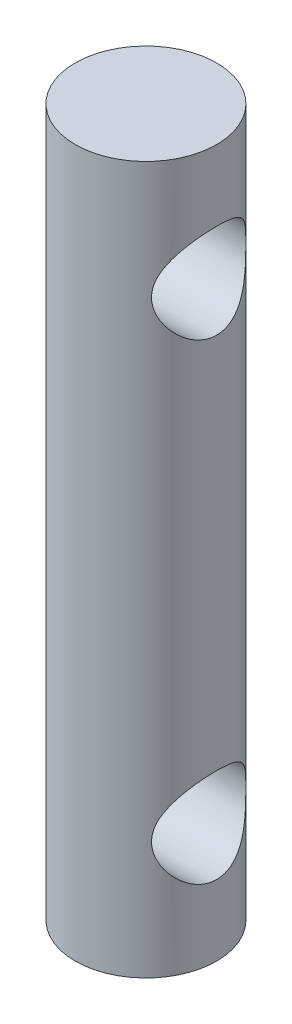
ISO-10303-21;
HEADER;
FILE_DESCRIPTION(('STEP AP214'),'2;1');
FILE_NAME('part.step','',(''),(''),'','','');
FILE_SCHEMA(('AUTOMOTIVE_DESIGN { 1 0 10303 214 1 1 1 1 }'));
ENDSEC;
DATA;
#1=APPLICATION_CONTEXT('core data for automotive mechanical design processes');
#2=APPLICATION_PROTOCOL_DEFINITION('international standard','automotive_design',2000,#1);
#3=PRODUCT_CONTEXT('',#1,'mechanical');
#4=PRODUCT('Part','Part','',(#3));
#5=PRODUCT_RELATED_PRODUCT_CATEGORY('part','',(#4));
#6=PRODUCT_DEFINITION_FORMATION('','',#4);
#7=PRODUCT_DEFINITION_CONTEXT('part definition',#1,'design');
#8=PRODUCT_DEFINITION('design','',#6,#7);
#9=PRODUCT_DEFINITION_SHAPE('','',#8);
#10=(LENGTH_UNIT() NAMED_UNIT(*) SI_UNIT(.MILLI.,.METRE.));
#11=(NAMED_UNIT(*) PLANE_ANGLE_UNIT() SI_UNIT($,.RADIAN.));
#12=(NAMED_UNIT(*) SI_UNIT($,.STERADIAN.) SOLID_ANGLE_UNIT());
#13=UNCERTAINTY_MEASURE_WITH_UNIT(LENGTH_MEASURE(1.E-05),#10,'distance_accuracy_value','');
#14=(GEOMETRIC_REPRESENTATION_CONTEXT(3) GLOBAL_UNCERTAINTY_ASSIGNED_CONTEXT((#13)) GLOBAL_UNIT_ASSIGNED_CONTEXT((#10,
#11,#12)) REPRESENTATION_CONTEXT('',''));
#15=CARTESIAN_POINT('',(0.,0.,0.));
#16=DIRECTION('',(0.,0.,1.));
#17=DIRECTION('',(1.,0.,0.));
#18=AXIS2_PLACEMENT_3D('',#15,#16,#17);
#19=CARTESIAN_POINT('',(0.,30.,0.));
#20=DIRECTION('',(0.,-1.,0.));
#21=DIRECTION('',(0.,0.,-1.));
#22=AXIS2_PLACEMENT_3D('',#19,#20,#21);
#23=CYLINDRICAL_SURFACE('',#22,3.);
#24=CARTESIAN_POINT('',(-2.23606797749979,5.,-2.));
#25=CARTESIAN_POINT('',(-2.23607753462816,5.09762831086862,-1.99999453997731));
#26=CARTESIAN_POINT('',(-2.24258071047442,5.1952907537088,-1.99278992503664));
#27=CARTESIAN_POINT('',(-2.26731972501617,5.38711991165081,-1.96458268317731));
#28=CARTESIAN_POINT('',(-2.2855766081271,5.48128003552956,-1.94355530587862));
#29=CARTESIAN_POINT('',(-2.3305658582557,5.66273544187768,-1.88935861676632));
#30=CARTESIAN_POINT('',(-2.35721561794601,5.75008769673766,-1.85630718014214));
#31=CARTESIAN_POINT('',(-2.41584094681825,5.91786583234666,-1.77934008393538));
#32=CARTESIAN_POINT('',(-2.44781762158831,5.99829026997647,-1.73542216812163));
#33=CARTESIAN_POINT('',(-2.51946072932026,6.16364688761691,-1.63002410007714));
#34=CARTESIAN_POINT('',(-2.55954936090364,6.2473321177172,-1.56687435451732));
#35=CARTESIAN_POINT('',(-2.63944827308083,6.40400270887428,-1.4281921974068));
#36=CARTESIAN_POINT('',(-2.67925824297985,6.47697752165853,-1.3526477317708));
#37=CARTESIAN_POINT('',(-2.76088818523747,6.62064365878166,-1.17815690494296));
#38=CARTESIAN_POINT('',(-2.80216785846923,6.68948251177567,-1.07740643965819));
#39=CARTESIAN_POINT('',(-2.87558484482764,6.80864209549007,-0.862470964212232));
#40=CARTESIAN_POINT('',(-2.90773236231037,6.85898351403119,-0.748301152321704));
#41=CARTESIAN_POINT('',(-2.95599907464725,6.93355640101745,-0.523249073480003));
#42=CARTESIAN_POINT('',(-2.97351175615867,6.96008334449556,-0.413434725181416));
#43=CARTESIAN_POINT('',(-2.99609745461921,6.99418448928365,-0.189695448729862));
#44=CARTESIAN_POINT('',(-3.00118613762359,7.00178255922544,-0.0757758812858249));
#45=CARTESIAN_POINT('',(-2.99855361722953,6.99782755005095,0.13414705023233));
#46=CARTESIAN_POINT('',(-2.99266264910127,6.98901094868294,0.230240638008753));
#47=CARTESIAN_POINT('',(-2.9720818279002,6.95790894864109,0.419238633271016));
#48=CARTESIAN_POINT('',(-2.95739133313102,6.93562256769646,0.512142807649724));
#49=CARTESIAN_POINT('',(-2.92052091703736,6.87880431520542,0.692077937671169));
#50=CARTESIAN_POINT('',(-2.89837077982679,6.84432111480144,0.779130623845962));
#51=CARTESIAN_POINT('',(-2.84821104476287,6.76444635704718,0.946209150653556));
#52=CARTESIAN_POINT('',(-2.82020037745161,6.71905280849849,1.0262337049694));
#53=CARTESIAN_POINT('',(-2.75618058450702,6.61202126254011,1.18828429196344));
#54=CARTESIAN_POINT('',(-2.71960408792025,6.54903247664721,1.26919148099708));
#55=CARTESIAN_POINT('',(-2.64400601826998,6.41210132051968,1.41998807498305));
#56=CARTESIAN_POINT('',(-2.60498072815232,6.33814205406619,1.48986013519457));
#57=CARTESIAN_POINT('',(-2.52150044944151,6.16803678978671,1.62772235326165));
#58=CARTESIAN_POINT('',(-2.47714320008931,6.07022892028551,1.69373593126354));
#59=CARTESIAN_POINT('',(-2.39475610831095,5.86249016077929,1.80834874945483));
#60=CARTESIAN_POINT('',(-2.3567157153489,5.7525800055861,1.85697718654898));
#61=CARTESIAN_POINT('',(-2.30262870306889,5.5552809379269,1.92332724567776));
#62=CARTESIAN_POINT('',(-2.28340364577667,5.47040662994312,1.94590791747533));
#63=CARTESIAN_POINT('',(-2.25409039789612,5.29696051018316,1.97979555580014));
#64=CARTESIAN_POINT('',(-2.24398636782354,5.20839538882738,1.99112206964395));
#65=CARTESIAN_POINT('',(-2.23447556987372,5.02955701355851,2.00179400148877));
#66=CARTESIAN_POINT('',(-2.2351153386647,4.93927802147988,2.00108729753098));
#67=CARTESIAN_POINT('',(-2.24709880368953,4.76031616604496,1.98761629716365));
#68=CARTESIAN_POINT('',(-2.2584511764885,4.67163465589261,1.97484222690381));
#69=CARTESIAN_POINT('',(-2.28927977500746,4.50261058245016,1.93899811187046));
#70=CARTESIAN_POINT('',(-2.30833187069749,4.42207229099742,1.91646174529973));
#71=CARTESIAN_POINT('',(-2.3522995853365,4.2658737639497,1.86223041628513));
#72=CARTESIAN_POINT('',(-2.3772171729463,4.19021517703699,1.83053237805351));
#73=CARTESIAN_POINT('',(-2.43611483596194,4.02979799615248,1.75163346599563));
#74=CARTESIAN_POINT('',(-2.47091081434316,3.9462431884573,1.70260028818246));
#75=CARTESIAN_POINT('',(-2.54262514806633,3.78758319738271,1.59352731501438));
#76=CARTESIAN_POINT('',(-2.57954604947543,3.71248848325755,1.53347411883828));
#77=CARTESIAN_POINT('',(-2.66075678321007,3.55603765253246,1.38876657712435));
#78=CARTESIAN_POINT('',(-2.70489452138573,3.47689715175168,1.30160386514207));
#79=CARTESIAN_POINT('',(-2.78775581841638,3.33418331705971,1.11309948866219));
#80=CARTESIAN_POINT('',(-2.82648414789457,3.27059622874327,1.01177047745701));
#81=CARTESIAN_POINT('',(-2.88790821242222,3.17210826108241,0.817487474821799));
#82=CARTESIAN_POINT('',(-2.91225458111008,3.13404349555963,0.726662364886322));
#83=CARTESIAN_POINT('',(-2.95278707867041,3.07139280567956,0.538757079020517));
#84=CARTESIAN_POINT('',(-2.96898009871993,3.04679549714023,0.441682263858772));
#85=CARTESIAN_POINT('',(-2.99178364026746,3.01230303616124,0.243369392303446));
#86=CARTESIAN_POINT('',(-2.99835150856533,3.00247332049332,0.142114836924321));
#87=CARTESIAN_POINT('',(-3.00109821029056,2.99835214858289,-0.0608555465807296));
#88=CARTESIAN_POINT('',(-2.99727800938902,3.00405924804382,-0.162571330953445));
#89=CARTESIAN_POINT('',(-2.98029555977324,3.0296594890047,-0.355757532528103));
#90=CARTESIAN_POINT('',(-2.96783277209856,3.0484909848618,-0.447435143070527));
#91=CARTESIAN_POINT('',(-2.93536106206933,3.09823800943089,-0.626018422997059));
#92=CARTESIAN_POINT('',(-2.91535096747103,3.12915541534726,-0.712923348686888));
#93=CARTESIAN_POINT('',(-2.86791765486194,3.20393870488402,-0.885147296608349));
#94=CARTESIAN_POINT('',(-2.84013248946338,3.24845030749508,-0.970083589200263));
#95=CARTESIAN_POINT('',(-2.77975408235472,3.34815064462598,-1.13155266268318));
#96=CARTESIAN_POINT('',(-2.74715796645263,3.403345767952,-1.20808037205002));
#97=CARTESIAN_POINT('',(-2.67392931472394,3.53262890233631,-1.36329422201402));
#98=CARTESIAN_POINT('',(-2.6328391387737,3.60832302367403,-1.44042679526091));
#99=CARTESIAN_POINT('',(-2.55053357649486,3.77111354154583,-1.58160022281595));
#100=CARTESIAN_POINT('',(-2.50931811970155,3.85821838883409,-1.64563128323923));
#101=CARTESIAN_POINT('',(-2.43384213590298,4.03586759075529,-1.75513253518411));
#102=CARTESIAN_POINT('',(-2.39929086741904,4.12564180995034,-1.8016464689721));
#103=CARTESIAN_POINT('',(-2.33747501591023,4.31328444899315,-1.88115802340272));
#104=CARTESIAN_POINT('',(-2.31019631295305,4.41113669386215,-1.91418190281333));
#105=CARTESIAN_POINT('',(-2.27191051929539,4.59077146842454,-1.95936262470908));
#106=CARTESIAN_POINT('',(-2.25863695410151,4.67130823679029,-1.97452228373248));
#107=CARTESIAN_POINT('',(-2.24071519216009,4.83455640050454,-1.99483915818926));
#108=CARTESIAN_POINT('',(-2.23605987841475,4.91726594426058,-2.00000462703715));
#109=CARTESIAN_POINT('',(-2.23606797749979,5.,-2.));
#110=B_SPLINE_CURVE_WITH_KNOTS('',3,(#24,#25,#26,#27,#28,#29,#30,#31,#32,#33,#34,#35,#36,#37,
#38,#39,#40,#41,#42,#43,#44,#45,#46,#47,#48,#49,#50,#51,#52,#53,#54,#55,#56,#57,#58,#59,#60,#61,
#62,#63,#64,#65,#66,#67,#68,#69,#70,#71,#72,#73,#74,#75,#76,#77,#78,#79,#80,#81,#82,#83,#84,#85,
#86,#87,#88,#89,#90,#91,#92,#93,#94,#95,#96,#97,#98,#99,#100,#101,#102,#103,#104,#105,#106,#107,
#108,#109),.UNSPECIFIED.,.T.,.F.,(4,2,2,2,2,2,2,2,2,2,2,2,2,2,2,2,2,2,2,2,2,2,2,2,2,2,2,2,2,2,2,
2,2,2,2,2,2,2,2,2,2,2,4),(0.,0.292506930722152,0.585539042259288,0.875772651216275,
1.16606657266549,1.50154677068638,1.83735518436276,2.2216703100629,2.6055542938858,
2.9463748206358,3.28676536688298,3.57539534955742,3.86404638283746,4.15155831973191,
4.43912276903,4.76447525946635,5.09033414796639,5.46678703504944,5.84260469743948,
6.11126090401325,6.37944966235487,6.64880037638036,6.91836943570598,7.17476451706936,
7.43124577644958,7.73899230052352,8.04711556801509,8.42254684520963,8.79764490572581,
9.10070580611699,9.40351012888472,9.70765229266165,10.0117661844615,10.2937678224973,
10.5758132789284,10.874178629859,11.1727229593109,11.5182220628451,11.863978504186,
12.1833412579672,12.5020793664923,12.7501661630426,12.9980479966543),.UNSPECIFIED.);
#111=CARTESIAN_POINT('',(-2.23606797749979,5.,-2.));
#112=VERTEX_POINT('',#111);
#113=EDGE_CURVE('E34',#112,#112,#110,.T.);
#114=ORIENTED_EDGE('',*,*,#113,.T.);
#115=EDGE_LOOP('',(#114));
#116=FACE_BOUND('',#115,.T.);
#117=CARTESIAN_POINT('',(2.23606797749979,5.,-2.));
#118=CARTESIAN_POINT('',(2.23607753462816,4.90237168913138,-1.99999453997731));
#119=CARTESIAN_POINT('',(2.24258071047442,4.8047092462912,-1.99278992503664));
#120=CARTESIAN_POINT('',(2.26731972501617,4.61288008834918,-1.96458268317731));
#121=CARTESIAN_POINT('',(2.2855766081271,4.51871996447043,-1.94355530587862));
#122=CARTESIAN_POINT('',(2.3305658582557,4.33726455812231,-1.88935861676632));
#123=CARTESIAN_POINT('',(2.35721561794601,4.24991230326234,-1.85630718014214));
#124=CARTESIAN_POINT('',(2.41584094681825,4.08213416765333,-1.77934008393539));
#125=CARTESIAN_POINT('',(2.44781762158831,4.00170973002352,-1.73542216812163));
#126=CARTESIAN_POINT('',(2.51946072932026,3.83635311238309,-1.63002410007714));
#127=CARTESIAN_POINT('',(2.55954936090364,3.7526678822828,-1.56687435451732));
#128=CARTESIAN_POINT('',(2.63944827308082,3.59599729112572,-1.4281921974068));
#129=CARTESIAN_POINT('',(2.67925824297985,3.52302247834147,-1.3526477317708));
#130=CARTESIAN_POINT('',(2.76088818523747,3.37935634121833,-1.17815690494296));
#131=CARTESIAN_POINT('',(2.80216785846923,3.31051748822433,-1.07740643965819));
#132=CARTESIAN_POINT('',(2.87558484482764,3.19135790450993,-0.862470964212235));
#133=CARTESIAN_POINT('',(2.90773236231037,3.14101648596881,-0.748301152321707));
#134=CARTESIAN_POINT('',(2.95599907464725,3.06644359898254,-0.523249073480006));
#135=CARTESIAN_POINT('',(2.97351175615867,3.03991665550444,-0.413434725181419));
#136=CARTESIAN_POINT('',(2.99609745461921,3.00581551071635,-0.189695448729864));
#137=CARTESIAN_POINT('',(3.00118613762359,2.99821744077456,-0.075775881285827));
#138=CARTESIAN_POINT('',(2.99855361722953,3.00217244994905,0.134147050232328));
#139=CARTESIAN_POINT('',(2.99266264910127,3.01098905131706,0.230240638008751));
#140=CARTESIAN_POINT('',(2.9720818279002,3.0420910513589,0.419238633271014));
#141=CARTESIAN_POINT('',(2.95739133313102,3.06437743230354,0.512142807649723));
#142=CARTESIAN_POINT('',(2.92052091703736,3.12119568479457,0.692077937671168));
#143=CARTESIAN_POINT('',(2.89837077982679,3.15567888519855,0.779130623845961));
#144=CARTESIAN_POINT('',(2.84821104476287,3.23555364295281,0.946209150653555));
#145=CARTESIAN_POINT('',(2.82020037745161,3.28094719150151,1.0262337049694));
#146=CARTESIAN_POINT('',(2.75618058450702,3.38797873745989,1.18828429196344));
#147=CARTESIAN_POINT('',(2.71960408792025,3.45096752335278,1.26919148099708));
#148=CARTESIAN_POINT('',(2.64400601826998,3.58789867948032,1.41998807498305));
#149=CARTESIAN_POINT('',(2.60498072815232,3.66185794593381,1.48986013519457));
#150=CARTESIAN_POINT('',(2.52150044944151,3.83196321021329,1.62772235326165));
#151=CARTESIAN_POINT('',(2.47714320008932,3.92977107971448,1.69373593126354));
#152=CARTESIAN_POINT('',(2.39475610831095,4.13750983922071,1.80834874945483));
#153=CARTESIAN_POINT('',(2.3567157153489,4.2474199944139,1.85697718654898));
#154=CARTESIAN_POINT('',(2.30262870306889,4.4447190620731,1.92332724567776));
#155=CARTESIAN_POINT('',(2.28340364577667,4.52959337005687,1.94590791747533));
#156=CARTESIAN_POINT('',(2.25409039789612,4.70303948981683,1.97979555580014));
#157=CARTESIAN_POINT('',(2.24398636782354,4.79160461117262,1.99112206964395));
#158=CARTESIAN_POINT('',(2.23447556987372,4.97044298644149,2.00179400148877));
#159=CARTESIAN_POINT('',(2.2351153386647,5.06072197852012,2.00108729753098));
#160=CARTESIAN_POINT('',(2.24709880368953,5.23968383395504,1.98761629716365));
#161=CARTESIAN_POINT('',(2.2584511764885,5.32836534410738,1.97484222690381));
#162=CARTESIAN_POINT('',(2.28927977500746,5.49738941754983,1.93899811187046));
#163=CARTESIAN_POINT('',(2.30833187069749,5.57792770900257,1.91646174529973));
#164=CARTESIAN_POINT('',(2.3522995853365,5.73412623605029,1.86223041628513));
#165=CARTESIAN_POINT('',(2.3772171729463,5.80978482296301,1.83053237805352));
#166=CARTESIAN_POINT('',(2.43611483596194,5.97020200384751,1.75163346599563));
#167=CARTESIAN_POINT('',(2.47091081434316,6.05375681154269,1.70260028818246));
#168=CARTESIAN_POINT('',(2.54262514806633,6.21241680261729,1.59352731501439));
#169=CARTESIAN_POINT('',(2.57954604947543,6.28751151674245,1.53347411883828));
#170=CARTESIAN_POINT('',(2.66075678321007,6.44396234746753,1.38876657712435));
#171=CARTESIAN_POINT('',(2.70489452138573,6.52310284824831,1.30160386514207));
#172=CARTESIAN_POINT('',(2.78775581841638,6.66581668294029,1.1130994886622));
#173=CARTESIAN_POINT('',(2.82648414789457,6.72940377125672,1.01177047745701));
#174=CARTESIAN_POINT('',(2.88790821242222,6.82789173891759,0.817487474821802));
#175=CARTESIAN_POINT('',(2.91225458111008,6.86595650444036,0.726662364886326));
#176=CARTESIAN_POINT('',(2.95278707867041,6.92860719432044,0.538757079020521));
#177=CARTESIAN_POINT('',(2.96898009871993,6.95320450285976,0.441682263858775));
#178=CARTESIAN_POINT('',(2.99178364026746,6.98769696383875,0.243369392303448));
#179=CARTESIAN_POINT('',(2.99835150856532,6.99752667950667,0.142114836924323));
#180=CARTESIAN_POINT('',(3.00109821029056,7.0016478514171,-0.0608555465807275));
#181=CARTESIAN_POINT('',(2.99727800938902,6.99594075195618,-0.162571330953444));
#182=CARTESIAN_POINT('',(2.98029555977324,6.9703405109953,-0.355757532528102));
#183=CARTESIAN_POINT('',(2.96783277209856,6.95150901513819,-0.447435143070527));
#184=CARTESIAN_POINT('',(2.93536106206933,6.9017619905691,-0.626018422997059));
#185=CARTESIAN_POINT('',(2.91535096747103,6.87084458465274,-0.712923348686887));
#186=CARTESIAN_POINT('',(2.86791765486194,6.79606129511597,-0.885147296608349));
#187=CARTESIAN_POINT('',(2.84013248946338,6.75154969250492,-0.970083589200263));
#188=CARTESIAN_POINT('',(2.77975408235472,6.65184935537401,-1.13155266268318));
#189=CARTESIAN_POINT('',(2.74715796645263,6.596654232048,-1.20808037205002));
#190=CARTESIAN_POINT('',(2.67392931472394,6.46737109766369,-1.36329422201402));
#191=CARTESIAN_POINT('',(2.6328391387737,6.39167697632596,-1.44042679526091));
#192=CARTESIAN_POINT('',(2.55053357649486,6.22888645845416,-1.58160022281596));
#193=CARTESIAN_POINT('',(2.50931811970155,6.14178161116591,-1.64563128323923));
#194=CARTESIAN_POINT('',(2.43384213590298,5.96413240924471,-1.75513253518411));
#195=CARTESIAN_POINT('',(2.39929086741904,5.87435819004966,-1.8016464689721));
#196=CARTESIAN_POINT('',(2.33747501591023,5.68671555100684,-1.88115802340272));
#197=CARTESIAN_POINT('',(2.31019631295305,5.58886330613785,-1.91418190281333));
#198=CARTESIAN_POINT('',(2.27191051929539,5.40922853157545,-1.95936262470908));
#199=CARTESIAN_POINT('',(2.25863695410151,5.3286917632097,-1.97452228373248));
#200=CARTESIAN_POINT('',(2.24071519216009,5.16544359949546,-1.99483915818926));
#201=CARTESIAN_POINT('',(2.23605987841475,5.08273405573942,-2.00000462703715));
#202=CARTESIAN_POINT('',(2.23606797749979,5.,-2.));
#203=B_SPLINE_CURVE_WITH_KNOTS('',3,(#117,#118,#119,#120,#121,#122,#123,#124,#125,#126,#127,
#128,#129,#130,#131,#132,#133,#134,#135,#136,#137,#138,#139,#140,#141,#142,#143,#144,#145,#146,
#147,#148,#149,#150,#151,#152,#153,#154,#155,#156,#157,#158,#159,#160,#161,#162,#163,#164,#165,
#166,#167,#168,#169,#170,#171,#172,#173,#174,#175,#176,#177,#178,#179,#180,#181,#182,#183,#184,
#185,#186,#187,#188,#189,#190,#191,#192,#193,#194,#195,#196,#197,#198,#199,#200,#201,#202),
.UNSPECIFIED.,.T.,.F.,(4,2,2,2,2,2,2,2,2,2,2,2,2,2,2,2,2,2,2,2,2,2,2,2,2,2,2,2,2,2,2,2,2,2,2,2,
2,2,2,2,2,2,4),(0.,0.292506930722152,0.585539042259287,0.875772651216273,1.16606657266549,
1.50154677068638,1.83735518436275,2.22167031006289,2.6055542938858,2.94637482063579,
3.28676536688298,3.57539534955742,3.86404638283746,4.15155831973191,4.43912276903,
4.76447525946635,5.09033414796639,5.46678703504944,5.84260469743948,6.11126090401325,
6.37944966235487,6.64880037638037,6.91836943570598,7.17476451706936,7.43124577644958,
7.73899230052352,8.04711556801509,8.42254684520963,8.7976449057258,9.10070580611698,
9.40351012888472,9.70765229266165,10.0117661844615,10.2937678224973,10.5758132789284,
10.874178629859,11.1727229593109,11.5182220628451,11.863978504186,12.1833412579672,
12.5020793664923,12.7501661630426,12.9980479966543),.UNSPECIFIED.);
#204=CARTESIAN_POINT('',(2.23606797749979,5.,-2.));
#205=VERTEX_POINT('',#204);
#206=EDGE_CURVE('E86',#205,#205,#203,.T.);
#207=ORIENTED_EDGE('',*,*,#206,.T.);
#208=EDGE_LOOP('',(#207));
#209=FACE_BOUND('',#208,.T.);
#210=CARTESIAN_POINT('',(-2.23606797749979,25.,-2.));
#211=CARTESIAN_POINT('',(-2.23607753462816,25.0976283108686,-1.99999453997731));
#212=CARTESIAN_POINT('',(-2.24258071047442,25.1952907537088,-1.99278992503664));
#213=CARTESIAN_POINT('',(-2.26731972501617,25.3871199116508,-1.96458268317731));
#214=CARTESIAN_POINT('',(-2.2855766081271,25.4812800355296,-1.94355530587863));
#215=CARTESIAN_POINT('',(-2.3305658582557,25.6627354418777,-1.88935861676632));
#216=CARTESIAN_POINT('',(-2.35721561794601,25.7500876967377,-1.85630718014214));
#217=CARTESIAN_POINT('',(-2.41584094681825,25.9178658323467,-1.77934008393538));
#218=CARTESIAN_POINT('',(-2.44781762158831,25.9982902699765,-1.73542216812163));
#219=CARTESIAN_POINT('',(-2.51946072932026,26.1636468876169,-1.63002410007714));
#220=CARTESIAN_POINT('',(-2.55954936090364,26.2473321177172,-1.56687435451732));
#221=CARTESIAN_POINT('',(-2.63944827308082,26.4040027088743,-1.4281921974068));
#222=CARTESIAN_POINT('',(-2.67925824297985,26.4769775216585,-1.3526477317708));
#223=CARTESIAN_POINT('',(-2.76088818523747,26.6206436587817,-1.17815690494296));
#224=CARTESIAN_POINT('',(-2.80216785846923,26.6894825117757,-1.07740643965819));
#225=CARTESIAN_POINT('',(-2.87558484482764,26.8086420954901,-0.862470964212235));
#226=CARTESIAN_POINT('',(-2.90773236231037,26.8589835140312,-0.748301152321706));
#227=CARTESIAN_POINT('',(-2.95599907464725,26.9335564010175,-0.523249073480004));
#228=CARTESIAN_POINT('',(-2.97351175615867,26.9600833444956,-0.413434725181418));
#229=CARTESIAN_POINT('',(-2.99609745461921,26.9941844892837,-0.189695448729863));
#230=CARTESIAN_POINT('',(-3.00118613762359,27.0017825592254,-0.0757758812858258));
#231=CARTESIAN_POINT('',(-2.99855361722953,26.9978275500509,0.134147050232329));
#232=CARTESIAN_POINT('',(-2.99266264910127,26.9890109486829,0.230240638008751));
#233=CARTESIAN_POINT('',(-2.9720818279002,26.9579089486411,0.419238633271014));
#234=CARTESIAN_POINT('',(-2.95739133313102,26.9356225676965,0.512142807649723));
#235=CARTESIAN_POINT('',(-2.92052091703736,26.8788043152054,0.692077937671169));
#236=CARTESIAN_POINT('',(-2.89837077982679,26.8443211148014,0.779130623845961));
#237=CARTESIAN_POINT('',(-2.84821104476287,26.7644463570472,0.946209150653556));
#238=CARTESIAN_POINT('',(-2.82020037745161,26.7190528084985,1.0262337049694));
#239=CARTESIAN_POINT('',(-2.75618058450702,26.6120212625401,1.18828429196344));
#240=CARTESIAN_POINT('',(-2.71960408792025,26.5490324766472,1.26919148099708));
#241=CARTESIAN_POINT('',(-2.64400601826998,26.4121013205197,1.41998807498305));
#242=CARTESIAN_POINT('',(-2.60498072815232,26.3381420540662,1.48986013519457));
#243=CARTESIAN_POINT('',(-2.52150044944152,26.1680367897867,1.62772235326165));
#244=CARTESIAN_POINT('',(-2.47714320008932,26.0702289202855,1.69373593126354));
#245=CARTESIAN_POINT('',(-2.39475610831095,25.8624901607793,1.80834874945483));
#246=CARTESIAN_POINT('',(-2.3567157153489,25.7525800055861,1.85697718654898));
#247=CARTESIAN_POINT('',(-2.30262870306889,25.5552809379269,1.92332724567776));
#248=CARTESIAN_POINT('',(-2.28340364577667,25.4704066299431,1.94590791747533));
#249=CARTESIAN_POINT('',(-2.25409039789612,25.2969605101832,1.97979555580014));
#250=CARTESIAN_POINT('',(-2.24398636782354,25.2083953888274,1.99112206964395));
#251=CARTESIAN_POINT('',(-2.23447556987372,25.0295570135585,2.00179400148877));
#252=CARTESIAN_POINT('',(-2.2351153386647,24.9392780214799,2.00108729753098));
#253=CARTESIAN_POINT('',(-2.24709880368953,24.760316166045,1.98761629716365));
#254=CARTESIAN_POINT('',(-2.2584511764885,24.6716346558926,1.97484222690381));
#255=CARTESIAN_POINT('',(-2.28927977500746,24.5026105824502,1.93899811187046));
#256=CARTESIAN_POINT('',(-2.30833187069749,24.4220722909974,1.91646174529973));
#257=CARTESIAN_POINT('',(-2.3522995853365,24.2658737639497,1.86223041628513));
#258=CARTESIAN_POINT('',(-2.3772171729463,24.190215177037,1.83053237805352));
#259=CARTESIAN_POINT('',(-2.43611483596194,24.0297979961525,1.75163346599563));
#260=CARTESIAN_POINT('',(-2.47091081434316,23.9462431884573,1.70260028818246));
#261=CARTESIAN_POINT('',(-2.54262514806633,23.7875831973827,1.59352731501439));
#262=CARTESIAN_POINT('',(-2.57954604947543,23.7124884832575,1.53347411883828));
#263=CARTESIAN_POINT('',(-2.66075678321007,23.5560376525325,1.38876657712435));
#264=CARTESIAN_POINT('',(-2.70489452138573,23.4768971517517,1.30160386514207));
#265=CARTESIAN_POINT('',(-2.78775581841638,23.3341833170597,1.11309948866219));
#266=CARTESIAN_POINT('',(-2.82648414789457,23.2705962287433,1.011770477457));
#267=CARTESIAN_POINT('',(-2.88790821242222,23.1721082610824,0.817487474821798));
#268=CARTESIAN_POINT('',(-2.91225458111008,23.1340434955596,0.726662364886322));
#269=CARTESIAN_POINT('',(-2.95278707867041,23.0713928056796,0.538757079020516));
#270=CARTESIAN_POINT('',(-2.96898009871993,23.0467954971402,0.44168226385877));
#271=CARTESIAN_POINT('',(-2.99178364026746,23.0123030361612,0.243369392303444));
#272=CARTESIAN_POINT('',(-2.99835150856533,23.0024733204933,0.142114836924318));
#273=CARTESIAN_POINT('',(-3.00109821029056,22.9983521485829,-0.060855546580732));
#274=CARTESIAN_POINT('',(-2.99727800938901,23.0040592480438,-0.162571330953447));
#275=CARTESIAN_POINT('',(-2.98029555977324,23.0296594890047,-0.355757532528106));
#276=CARTESIAN_POINT('',(-2.96783277209856,23.0484909848618,-0.44743514307053));
#277=CARTESIAN_POINT('',(-2.93536106206933,23.0982380094309,-0.626018422997062));
#278=CARTESIAN_POINT('',(-2.91535096747103,23.1291554153473,-0.712923348686889));
#279=CARTESIAN_POINT('',(-2.86791765486194,23.203938704884,-0.885147296608351));
#280=CARTESIAN_POINT('',(-2.84013248946338,23.2484503074951,-0.970083589200266));
#281=CARTESIAN_POINT('',(-2.77975408235472,23.348150644626,-1.13155266268318));
#282=CARTESIAN_POINT('',(-2.74715796645263,23.403345767952,-1.20808037205002));
#283=CARTESIAN_POINT('',(-2.67392931472394,23.5326289023363,-1.36329422201402));
#284=CARTESIAN_POINT('',(-2.6328391387737,23.608323023674,-1.44042679526091));
#285=CARTESIAN_POINT('',(-2.55053357649486,23.7711135415458,-1.58160022281596));
#286=CARTESIAN_POINT('',(-2.50931811970154,23.8582183888341,-1.64563128323923));
#287=CARTESIAN_POINT('',(-2.43384213590298,24.0358675907553,-1.75513253518411));
#288=CARTESIAN_POINT('',(-2.39929086741904,24.1256418099503,-1.8016464689721));
#289=CARTESIAN_POINT('',(-2.33747501591022,24.3132844489932,-1.88115802340273));
#290=CARTESIAN_POINT('',(-2.31019631295305,24.4111366938622,-1.91418190281333));
#291=CARTESIAN_POINT('',(-2.27191051929539,24.5907714684246,-1.95936262470908));
#292=CARTESIAN_POINT('',(-2.25863695410151,24.6713082367903,-1.97452228373248));
#293=CARTESIAN_POINT('',(-2.24071519216008,24.8345564005045,-1.99483915818926));
#294=CARTESIAN_POINT('',(-2.23605987841475,24.9172659442606,-2.00000462703715));
#295=CARTESIAN_POINT('',(-2.23606797749979,25.,-2.));
#296=B_SPLINE_CURVE_WITH_KNOTS('',3,(#210,#211,#212,#213,#214,#215,#216,#217,#218,#219,#220,
#221,#222,#223,#224,#225,#226,#227,#228,#229,#230,#231,#232,#233,#234,#235,#236,#237,#238,#239,
#240,#241,#242,#243,#244,#245,#246,#247,#248,#249,#250,#251,#252,#253,#254,#255,#256,#257,#258,
#259,#260,#261,#262,#263,#264,#265,#266,#267,#268,#269,#270,#271,#272,#273,#274,#275,#276,#277,
#278,#279,#280,#281,#282,#283,#284,#285,#286,#287,#288,#289,#290,#291,#292,#293,#294,#295),
.UNSPECIFIED.,.T.,.F.,(4,2,2,2,2,2,2,2,2,2,2,2,2,2,2,2,2,2,2,2,2,2,2,2,2,2,2,2,2,2,2,2,2,2,2,2,
2,2,2,2,2,2,4),(0.,0.292506930722154,0.585539042259287,0.875772651216276,1.16606657266549,
1.50154677068638,1.83735518436275,2.22167031006289,2.6055542938858,2.9463748206358,
3.28676536688298,3.57539534955742,3.86404638283746,4.15155831973191,4.43912276903,
4.76447525946635,5.09033414796639,5.46678703504944,5.84260469743948,6.11126090401324,
6.37944966235487,6.64880037638037,6.91836943570598,7.17476451706936,7.43124577644958,
7.73899230052352,8.0471155680151,8.42254684520964,8.79764490572581,9.10070580611699,
9.40351012888473,9.70765229266166,10.0117661844615,10.2937678224973,10.5758132789284,
10.874178629859,11.1727229593109,11.5182220628452,11.8639785041861,12.1833412579672,
12.5020793664923,12.7501661630426,12.9980479966543),.UNSPECIFIED.);
#297=CARTESIAN_POINT('',(-2.23606797749979,25.,-2.));
#298=VERTEX_POINT('',#297);
#299=EDGE_CURVE('E47',#298,#298,#296,.T.);
#300=ORIENTED_EDGE('',*,*,#299,.T.);
#301=EDGE_LOOP('',(#300));
#302=FACE_BOUND('',#301,.T.);
#303=CARTESIAN_POINT('',(2.23606797749979,25.,-2.));
#304=CARTESIAN_POINT('',(2.23607753462816,24.9023716891314,-1.99999453997731));
#305=CARTESIAN_POINT('',(2.24258071047442,24.8047092462912,-1.99278992503664));
#306=CARTESIAN_POINT('',(2.26731972501617,24.6128800883492,-1.96458268317731));
#307=CARTESIAN_POINT('',(2.2855766081271,24.5187199644704,-1.94355530587863));
#308=CARTESIAN_POINT('',(2.3305658582557,24.3372645581223,-1.88935861676632));
#309=CARTESIAN_POINT('',(2.35721561794601,24.2499123032623,-1.85630718014214));
#310=CARTESIAN_POINT('',(2.41584094681825,24.0821341676533,-1.77934008393539));
#311=CARTESIAN_POINT('',(2.44781762158831,24.0017097300235,-1.73542216812163));
#312=CARTESIAN_POINT('',(2.51946072932026,23.8363531123831,-1.63002410007714));
#313=CARTESIAN_POINT('',(2.55954936090363,23.7526678822828,-1.56687435451732));
#314=CARTESIAN_POINT('',(2.63944827308082,23.5959972911257,-1.4281921974068));
#315=CARTESIAN_POINT('',(2.67925824297985,23.5230224783415,-1.3526477317708));
#316=CARTESIAN_POINT('',(2.76088818523747,23.3793563412183,-1.17815690494296));
#317=CARTESIAN_POINT('',(2.80216785846923,23.3105174882243,-1.07740643965819));
#318=CARTESIAN_POINT('',(2.87558484482764,23.1913579045099,-0.862470964212235));
#319=CARTESIAN_POINT('',(2.90773236231037,23.1410164859688,-0.748301152321706));
#320=CARTESIAN_POINT('',(2.95599907464725,23.0664435989825,-0.523249073480005));
#321=CARTESIAN_POINT('',(2.97351175615867,23.0399166555044,-0.413434725181418));
#322=CARTESIAN_POINT('',(2.99609745461921,23.0058155107163,-0.189695448729863));
#323=CARTESIAN_POINT('',(3.00118613762359,22.9982174407746,-0.0757758812858258));
#324=CARTESIAN_POINT('',(2.99855361722953,23.0021724499491,0.134147050232329));
#325=CARTESIAN_POINT('',(2.99266264910127,23.0109890513171,0.230240638008752));
#326=CARTESIAN_POINT('',(2.9720818279002,23.0420910513589,0.419238633271015));
#327=CARTESIAN_POINT('',(2.95739133313102,23.0643774323035,0.512142807649724));
#328=CARTESIAN_POINT('',(2.92052091703736,23.1211956847946,0.692077937671169));
#329=CARTESIAN_POINT('',(2.89837077982679,23.1556788851986,0.779130623845962));
#330=CARTESIAN_POINT('',(2.84821104476287,23.2355536429528,0.946209150653557));
#331=CARTESIAN_POINT('',(2.82020037745161,23.2809471915015,1.0262337049694));
#332=CARTESIAN_POINT('',(2.75618058450702,23.3879787374599,1.18828429196344));
#333=CARTESIAN_POINT('',(2.71960408792025,23.4509675233528,1.26919148099708));
#334=CARTESIAN_POINT('',(2.64400601826998,23.5878986794803,1.41998807498305));
#335=CARTESIAN_POINT('',(2.60498072815232,23.6618579459338,1.48986013519457));
#336=CARTESIAN_POINT('',(2.52150044944151,23.8319632102133,1.62772235326165));
#337=CARTESIAN_POINT('',(2.47714320008931,23.9297710797145,1.69373593126354));
#338=CARTESIAN_POINT('',(2.39475610831095,24.1375098392207,1.80834874945483));
#339=CARTESIAN_POINT('',(2.35671571534889,24.2474199944139,1.85697718654898));
#340=CARTESIAN_POINT('',(2.30262870306889,24.4447190620731,1.92332724567776));
#341=CARTESIAN_POINT('',(2.28340364577667,24.5295933700569,1.94590791747533));
#342=CARTESIAN_POINT('',(2.25409039789612,24.7030394898168,1.97979555580014));
#343=CARTESIAN_POINT('',(2.24398636782354,24.7916046111726,1.99112206964395));
#344=CARTESIAN_POINT('',(2.23447556987372,24.9704429864415,2.00179400148877));
#345=CARTESIAN_POINT('',(2.2351153386647,25.0607219785201,2.00108729753098));
#346=CARTESIAN_POINT('',(2.24709880368953,25.239683833955,1.98761629716365));
#347=CARTESIAN_POINT('',(2.2584511764885,25.3283653441074,1.97484222690381));
#348=CARTESIAN_POINT('',(2.28927977500746,25.4973894175498,1.93899811187046));
#349=CARTESIAN_POINT('',(2.30833187069749,25.5779277090026,1.91646174529973));
#350=CARTESIAN_POINT('',(2.3522995853365,25.7341262360503,1.86223041628513));
#351=CARTESIAN_POINT('',(2.3772171729463,25.809784822963,1.83053237805352));
#352=CARTESIAN_POINT('',(2.43611483596194,25.9702020038475,1.75163346599563));
#353=CARTESIAN_POINT('',(2.47091081434316,26.0537568115427,1.70260028818246));
#354=CARTESIAN_POINT('',(2.54262514806633,26.2124168026173,1.59352731501439));
#355=CARTESIAN_POINT('',(2.57954604947543,26.2875115167425,1.53347411883828));
#356=CARTESIAN_POINT('',(2.66075678321007,26.4439623474675,1.38876657712436));
#357=CARTESIAN_POINT('',(2.70489452138573,26.5231028482483,1.30160386514208));
#358=CARTESIAN_POINT('',(2.78775581841637,26.6658166829403,1.1130994886622));
#359=CARTESIAN_POINT('',(2.82648414789457,26.7294037712567,1.01177047745701));
#360=CARTESIAN_POINT('',(2.88790821242221,26.8278917389176,0.817487474821806));
#361=CARTESIAN_POINT('',(2.91225458111008,26.8659565044404,0.72666236488633));
#362=CARTESIAN_POINT('',(2.95278707867041,26.9286071943204,0.538757079020524));
#363=CARTESIAN_POINT('',(2.96898009871993,26.9532045028598,0.441682263858778));
#364=CARTESIAN_POINT('',(2.99178364026746,26.9876969638388,0.243369392303451));
#365=CARTESIAN_POINT('',(2.99835150856532,26.9975266795067,0.142114836924327));
#366=CARTESIAN_POINT('',(3.00109821029056,27.0016478514171,-0.0608555465807244));
#367=CARTESIAN_POINT('',(2.99727800938902,26.9959407519562,-0.162571330953441));
#368=CARTESIAN_POINT('',(2.98029555977324,26.9703405109953,-0.355757532528101));
#369=CARTESIAN_POINT('',(2.96783277209856,26.9515090151382,-0.447435143070525));
#370=CARTESIAN_POINT('',(2.93536106206933,26.9017619905691,-0.626018422997058));
#371=CARTESIAN_POINT('',(2.91535096747103,26.8708445846527,-0.712923348686886));
#372=CARTESIAN_POINT('',(2.86791765486194,26.796061295116,-0.885147296608347));
#373=CARTESIAN_POINT('',(2.84013248946338,26.7515496925049,-0.970083589200261));
#374=CARTESIAN_POINT('',(2.77975408235472,26.651849355374,-1.13155266268318));
#375=CARTESIAN_POINT('',(2.74715796645263,26.596654232048,-1.20808037205002));
#376=CARTESIAN_POINT('',(2.67392931472394,26.4673710976637,-1.36329422201402));
#377=CARTESIAN_POINT('',(2.6328391387737,26.391676976326,-1.44042679526091));
#378=CARTESIAN_POINT('',(2.55053357649486,26.2288864584542,-1.58160022281596));
#379=CARTESIAN_POINT('',(2.50931811970155,26.1417816111659,-1.64563128323923));
#380=CARTESIAN_POINT('',(2.43384213590298,25.9641324092447,-1.75513253518411));
#381=CARTESIAN_POINT('',(2.39929086741904,25.8743581900497,-1.8016464689721));
#382=CARTESIAN_POINT('',(2.33747501591023,25.6867155510068,-1.88115802340272));
#383=CARTESIAN_POINT('',(2.31019631295305,25.5888633061379,-1.91418190281333));
#384=CARTESIAN_POINT('',(2.27191051929539,25.4092285315755,-1.95936262470908));
#385=CARTESIAN_POINT('',(2.25863695410151,25.3286917632097,-1.97452228373248));
#386=CARTESIAN_POINT('',(2.24071519216008,25.1654435994955,-1.99483915818926));
#387=CARTESIAN_POINT('',(2.23605987841475,25.0827340557394,-2.00000462703715));
#388=CARTESIAN_POINT('',(2.23606797749979,25.,-2.));
#389=B_SPLINE_CURVE_WITH_KNOTS('',3,(#303,#304,#305,#306,#307,#308,#309,#310,#311,#312,#313,
#314,#315,#316,#317,#318,#319,#320,#321,#322,#323,#324,#325,#326,#327,#328,#329,#330,#331,#332,
#333,#334,#335,#336,#337,#338,#339,#340,#341,#342,#343,#344,#345,#346,#347,#348,#349,#350,#351,
#352,#353,#354,#355,#356,#357,#358,#359,#360,#361,#362,#363,#364,#365,#366,#367,#368,#369,#370,
#371,#372,#373,#374,#375,#376,#377,#378,#379,#380,#381,#382,#383,#384,#385,#386,#387,#388),
.UNSPECIFIED.,.T.,.F.,(4,2,2,2,2,2,2,2,2,2,2,2,2,2,2,2,2,2,2,2,2,2,2,2,2,2,2,2,2,2,2,2,2,2,2,2,
2,2,2,2,2,2,4),(0.,0.292506930722154,0.585539042259288,0.875772651216276,1.16606657266549,
1.50154677068637,1.83735518436275,2.22167031006289,2.6055542938858,2.9463748206358,
3.28676536688298,3.57539534955742,3.86404638283746,4.15155831973191,4.43912276903,
4.76447525946635,5.09033414796639,5.46678703504944,5.84260469743948,6.11126090401325,
6.37944966235487,6.64880037638036,6.91836943570598,7.17476451706936,7.43124577644957,
7.73899230052352,8.04711556801509,8.42254684520962,8.7976449057258,9.10070580611698,
9.40351012888472,9.70765229266164,10.0117661844615,10.2937678224973,10.5758132789284,
10.874178629859,11.1727229593109,11.5182220628451,11.863978504186,12.1833412579672,
12.5020793664923,12.7501661630426,12.9980479966543),.UNSPECIFIED.);
#390=CARTESIAN_POINT('',(2.23606797749979,25.,-2.));
#391=VERTEX_POINT('',#390);
#392=EDGE_CURVE('E50',#391,#391,#389,.T.);
#393=ORIENTED_EDGE('',*,*,#392,.T.);
#394=EDGE_LOOP('',(#393));
#395=FACE_BOUND('',#394,.T.);
#396=CARTESIAN_POINT('',(0.,30.,0.));
#397=DIRECTION('',(0.,1.,0.));
#398=DIRECTION('',(0.,0.,1.));
#399=AXIS2_PLACEMENT_3D('',#396,#397,#398);
#400=CIRCLE('',#399,3.);
#401=CARTESIAN_POINT('',(0.,30.,3.));
#402=VERTEX_POINT('',#401);
#403=EDGE_CURVE('E10',#402,#402,#400,.T.);
#404=ORIENTED_EDGE('',*,*,#403,.F.);
#405=EDGE_LOOP('',(#404));
#406=FACE_BOUND('',#405,.T.);
#407=CARTESIAN_POINT('',(0.,0.,0.));
#408=DIRECTION('',(0.,1.,0.));
#409=DIRECTION('',(0.,0.,1.));
#410=AXIS2_PLACEMENT_3D('',#407,#408,#409);
#411=CIRCLE('',#410,3.);
#412=CARTESIAN_POINT('',(0.,0.,3.));
#413=VERTEX_POINT('',#412);
#414=EDGE_CURVE('E42',#413,#413,#411,.T.);
#415=ORIENTED_EDGE('',*,*,#414,.T.);
#416=EDGE_LOOP('',(#415));
#417=FACE_BOUND('',#416,.T.);
#418=ADVANCED_FACE('F30',(#116,#209,#302,#395,#406,#417),#23,.T.);
#419=CARTESIAN_POINT('',(0.,30.,0.));
#420=DIRECTION('',(0.,1.,0.));
#421=DIRECTION('',(0.,0.,1.));
#422=AXIS2_PLACEMENT_3D('',#419,#420,#421);
#423=PLANE('',#422);
#424=ORIENTED_EDGE('',*,*,#403,.T.);
#425=EDGE_LOOP('',(#424));
#426=FACE_BOUND('',#425,.T.);
#427=ADVANCED_FACE('F68',(#426),#423,.T.);
#428=CARTESIAN_POINT('',(0.,0.,0.));
#429=DIRECTION('',(0.,1.,0.));
#430=DIRECTION('',(0.,0.,1.));
#431=AXIS2_PLACEMENT_3D('',#428,#429,#430);
#432=PLANE('',#431);
#433=ORIENTED_EDGE('',*,*,#414,.F.);
#434=EDGE_LOOP('',(#433));
#435=FACE_BOUND('',#434,.T.);
#436=ADVANCED_FACE('F65',(#435),#432,.F.);
#437=CARTESIAN_POINT('',(-7.5,25.,0.));
#438=DIRECTION('',(1.,0.,0.));
#439=DIRECTION('',(0.,0.,-1.));
#440=AXIS2_PLACEMENT_3D('',#437,#438,#439);
#441=CYLINDRICAL_SURFACE('',#440,2.);
#442=ORIENTED_EDGE('',*,*,#392,.F.);
#443=EDGE_LOOP('',(#442));
#444=FACE_BOUND('',#443,.T.);
#445=ORIENTED_EDGE('',*,*,#299,.F.);
#446=EDGE_LOOP('',(#445));
#447=FACE_BOUND('',#446,.T.);
#448=ADVANCED_FACE('F60',(#444,#447),#441,.F.);
#449=CARTESIAN_POINT('',(-7.5,5.,0.));
#450=DIRECTION('',(1.,0.,0.));
#451=DIRECTION('',(0.,0.,-1.));
#452=AXIS2_PLACEMENT_3D('',#449,#450,#451);
#453=CYLINDRICAL_SURFACE('',#452,2.);
#454=ORIENTED_EDGE('',*,*,#206,.F.);
#455=EDGE_LOOP('',(#454));
#456=FACE_BOUND('',#455,.T.);
#457=ORIENTED_EDGE('',*,*,#113,.F.);
#458=EDGE_LOOP('',(#457));
#459=FACE_BOUND('',#458,.T.);
#460=ADVANCED_FACE('F64',(#456,#459),#453,.F.);
#461=CLOSED_SHELL('',(#418,#427,#436,#448,#460));
#462=MANIFOLD_SOLID_BREP('B2',#461);
#463=ADVANCED_BREP_SHAPE_REPRESENTATION('',(#18,#462),#14);
#464=SHAPE_DEFINITION_REPRESENTATION(#9,#463);
ENDSEC;
END-ISO-10303-21;
